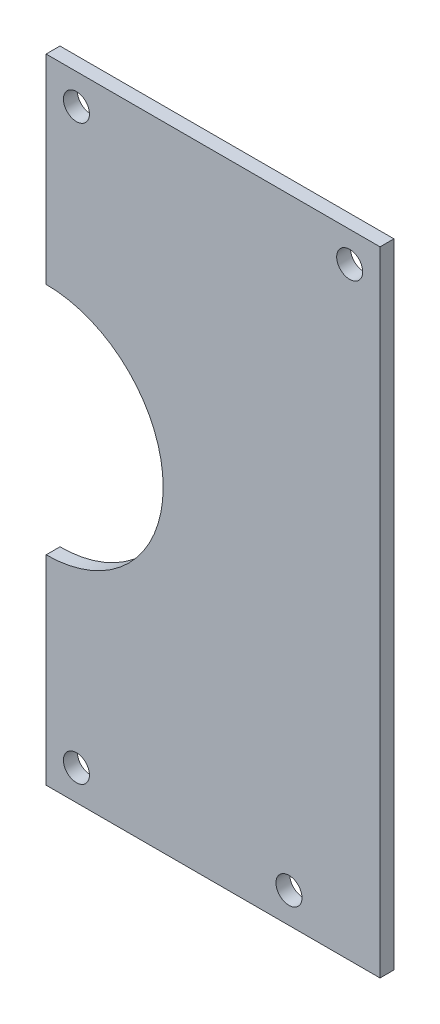
ISO-10303-21;
HEADER;
FILE_DESCRIPTION(('STEP AP214'),'2;1');
FILE_NAME('part.step','',(''),(''),'','','');
FILE_SCHEMA(('AUTOMOTIVE_DESIGN { 1 0 10303 214 1 1 1 1 }'));
ENDSEC;
DATA;
#1=APPLICATION_CONTEXT('core data for automotive mechanical design processes');
#2=APPLICATION_PROTOCOL_DEFINITION('international standard','automotive_design',2000,#1);
#3=PRODUCT_CONTEXT('',#1,'mechanical');
#4=PRODUCT('Part','Part','',(#3));
#5=PRODUCT_RELATED_PRODUCT_CATEGORY('part','',(#4));
#6=PRODUCT_DEFINITION_FORMATION('','',#4);
#7=PRODUCT_DEFINITION_CONTEXT('part definition',#1,'design');
#8=PRODUCT_DEFINITION('design','',#6,#7);
#9=PRODUCT_DEFINITION_SHAPE('','',#8);
#10=(LENGTH_UNIT() NAMED_UNIT(*) SI_UNIT(.MILLI.,.METRE.));
#11=(NAMED_UNIT(*) PLANE_ANGLE_UNIT() SI_UNIT($,.RADIAN.));
#12=(NAMED_UNIT(*) SI_UNIT($,.STERADIAN.) SOLID_ANGLE_UNIT());
#13=UNCERTAINTY_MEASURE_WITH_UNIT(LENGTH_MEASURE(1.E-05),#10,'distance_accuracy_value','');
#14=(GEOMETRIC_REPRESENTATION_CONTEXT(3) GLOBAL_UNCERTAINTY_ASSIGNED_CONTEXT((#13)) GLOBAL_UNIT_ASSIGNED_CONTEXT((#10,
#11,#12)) REPRESENTATION_CONTEXT('',''));
#15=CARTESIAN_POINT('',(0.,0.,0.));
#16=DIRECTION('',(0.,0.,1.));
#17=DIRECTION('',(1.,0.,0.));
#18=AXIS2_PLACEMENT_3D('',#15,#16,#17);
#19=CARTESIAN_POINT('',(0.,-36.5,-1.6));
#20=DIRECTION('',(-1.,0.,0.));
#21=DIRECTION('',(0.,0.,1.));
#22=AXIS2_PLACEMENT_3D('',#19,#20,#21);
#23=PLANE('',#22);
#24=DIRECTION('',(0.,-1.,0.));
#25=VECTOR('',#24,1.);
#26=CARTESIAN_POINT('',(0.,-36.5,0.));
#27=LINE('',#26,#25);
#28=CARTESIAN_POINT('',(0.,-13.5,0.));
#29=VERTEX_POINT('',#28);
#30=CARTESIAN_POINT('',(0.,-36.5,0.));
#31=VERTEX_POINT('',#30);
#32=EDGE_CURVE('E131',#29,#31,#27,.T.);
#33=ORIENTED_EDGE('',*,*,#32,.F.);
#34=DIRECTION('',(0.,0.,1.));
#35=VECTOR('',#34,1.);
#36=CARTESIAN_POINT('',(0.,-13.5,-1.6));
#37=LINE('',#36,#35);
#38=CARTESIAN_POINT('',(0.,-13.5,-1.6));
#39=VERTEX_POINT('',#38);
#40=EDGE_CURVE('E47',#39,#29,#37,.T.);
#41=ORIENTED_EDGE('',*,*,#40,.F.);
#42=DIRECTION('',(0.,-1.,0.));
#43=VECTOR('',#42,1.);
#44=CARTESIAN_POINT('',(0.,-36.5,-1.6));
#45=LINE('',#44,#43);
#46=CARTESIAN_POINT('',(0.,-36.5,-1.6));
#47=VERTEX_POINT('',#46);
#48=EDGE_CURVE('E109',#39,#47,#45,.T.);
#49=ORIENTED_EDGE('',*,*,#48,.T.);
#50=DIRECTION('',(0.,0.,1.));
#51=VECTOR('',#50,1.);
#52=CARTESIAN_POINT('',(0.,-36.5,-1.6));
#53=LINE('',#52,#51);
#54=EDGE_CURVE('E11',#47,#31,#53,.T.);
#55=ORIENTED_EDGE('',*,*,#54,.T.);
#56=EDGE_LOOP('',(#33,#41,#49,#55));
#57=FACE_BOUND('',#56,.T.);
#58=ADVANCED_FACE('F37',(#57),#23,.T.);
#59=CARTESIAN_POINT('',(0.,0.,-1.6));
#60=DIRECTION('',(0.,0.,1.));
#61=DIRECTION('',(1.,0.,0.));
#62=AXIS2_PLACEMENT_3D('',#59,#60,#61);
#63=CYLINDRICAL_SURFACE('',#62,13.5);
#64=CARTESIAN_POINT('',(0.,0.,0.));
#65=DIRECTION('',(0.,0.,-1.));
#66=DIRECTION('',(-1.,0.,0.));
#67=AXIS2_PLACEMENT_3D('',#64,#65,#66);
#68=CIRCLE('',#67,13.5);
#69=CARTESIAN_POINT('',(0.,13.5,0.));
#70=VERTEX_POINT('',#69);
#71=EDGE_CURVE('E96',#70,#29,#68,.T.);
#72=ORIENTED_EDGE('',*,*,#71,.F.);
#73=DIRECTION('',(0.,0.,1.));
#74=VECTOR('',#73,1.);
#75=CARTESIAN_POINT('',(0.,13.5,-1.6));
#76=LINE('',#75,#74);
#77=CARTESIAN_POINT('',(0.,13.5,-1.6));
#78=VERTEX_POINT('',#77);
#79=EDGE_CURVE('E91',#78,#70,#76,.T.);
#80=ORIENTED_EDGE('',*,*,#79,.F.);
#81=CARTESIAN_POINT('',(0.,0.,-1.6));
#82=DIRECTION('',(0.,0.,-1.));
#83=DIRECTION('',(-1.,0.,0.));
#84=AXIS2_PLACEMENT_3D('',#81,#82,#83);
#85=CIRCLE('',#84,13.5);
#86=EDGE_CURVE('E94',#78,#39,#85,.T.);
#87=ORIENTED_EDGE('',*,*,#86,.T.);
#88=ORIENTED_EDGE('',*,*,#40,.T.);
#89=EDGE_LOOP('',(#72,#80,#87,#88));
#90=FACE_BOUND('',#89,.T.);
#91=ADVANCED_FACE('F93',(#90),#63,.F.);
#92=CARTESIAN_POINT('',(0.,36.5,-1.6));
#93=DIRECTION('',(-1.,0.,0.));
#94=DIRECTION('',(0.,0.,1.));
#95=AXIS2_PLACEMENT_3D('',#92,#93,#94);
#96=PLANE('',#95);
#97=DIRECTION('',(0.,-1.,0.));
#98=VECTOR('',#97,1.);
#99=CARTESIAN_POINT('',(0.,36.5,0.));
#100=LINE('',#99,#98);
#101=CARTESIAN_POINT('',(0.,36.5,0.));
#102=VERTEX_POINT('',#101);
#103=EDGE_CURVE('E128',#102,#70,#100,.T.);
#104=ORIENTED_EDGE('',*,*,#103,.F.);
#105=DIRECTION('',(0.,0.,1.));
#106=VECTOR('',#105,1.);
#107=CARTESIAN_POINT('',(0.,36.5,-1.6));
#108=LINE('',#107,#106);
#109=CARTESIAN_POINT('',(0.,36.5,-1.6));
#110=VERTEX_POINT('',#109);
#111=EDGE_CURVE('E101',#110,#102,#108,.T.);
#112=ORIENTED_EDGE('',*,*,#111,.F.);
#113=DIRECTION('',(0.,-1.,0.));
#114=VECTOR('',#113,1.);
#115=CARTESIAN_POINT('',(0.,36.5,-1.6));
#116=LINE('',#115,#114);
#117=EDGE_CURVE('E107',#110,#78,#116,.T.);
#118=ORIENTED_EDGE('',*,*,#117,.T.);
#119=ORIENTED_EDGE('',*,*,#79,.T.);
#120=EDGE_LOOP('',(#104,#112,#118,#119));
#121=FACE_BOUND('',#120,.T.);
#122=ADVANCED_FACE('F112',(#121),#96,.T.);
#123=CARTESIAN_POINT('',(13.5,36.5,-1.6));
#124=DIRECTION('',(0.,1.,0.));
#125=DIRECTION('',(0.,0.,1.));
#126=AXIS2_PLACEMENT_3D('',#123,#124,#125);
#127=PLANE('',#126);
#128=DIRECTION('',(-1.,0.,0.));
#129=VECTOR('',#128,1.);
#130=CARTESIAN_POINT('',(13.5,36.5,0.));
#131=LINE('',#130,#129);
#132=CARTESIAN_POINT('',(38.5,36.5,0.));
#133=VERTEX_POINT('',#132);
#134=EDGE_CURVE('E125',#133,#102,#131,.T.);
#135=ORIENTED_EDGE('',*,*,#134,.F.);
#136=DIRECTION('',(0.,0.,1.));
#137=VECTOR('',#136,1.);
#138=CARTESIAN_POINT('',(38.5,36.5,-1.6));
#139=LINE('',#138,#137);
#140=CARTESIAN_POINT('',(38.5,36.5,-1.6));
#141=VERTEX_POINT('',#140);
#142=EDGE_CURVE('E135',#141,#133,#139,.T.);
#143=ORIENTED_EDGE('',*,*,#142,.F.);
#144=DIRECTION('',(-1.,0.,0.));
#145=VECTOR('',#144,1.);
#146=CARTESIAN_POINT('',(13.5,36.5,-1.6));
#147=LINE('',#146,#145);
#148=EDGE_CURVE('E113',#141,#110,#147,.T.);
#149=ORIENTED_EDGE('',*,*,#148,.T.);
#150=ORIENTED_EDGE('',*,*,#111,.T.);
#151=EDGE_LOOP('',(#135,#143,#149,#150));
#152=FACE_BOUND('',#151,.T.);
#153=ADVANCED_FACE('F157',(#152),#127,.T.);
#154=CARTESIAN_POINT('',(38.5,-36.5,-1.6));
#155=DIRECTION('',(1.,0.,0.));
#156=DIRECTION('',(0.,0.,-1.));
#157=AXIS2_PLACEMENT_3D('',#154,#155,#156);
#158=PLANE('',#157);
#159=DIRECTION('',(0.,1.,0.));
#160=VECTOR('',#159,1.);
#161=CARTESIAN_POINT('',(38.5,-36.5,0.));
#162=LINE('',#161,#160);
#163=CARTESIAN_POINT('',(38.5,-36.5,0.));
#164=VERTEX_POINT('',#163);
#165=EDGE_CURVE('E121',#164,#133,#162,.T.);
#166=ORIENTED_EDGE('',*,*,#165,.F.);
#167=DIRECTION('',(0.,0.,1.));
#168=VECTOR('',#167,1.);
#169=CARTESIAN_POINT('',(38.5,-36.5,-1.6));
#170=LINE('',#169,#168);
#171=CARTESIAN_POINT('',(38.5,-36.5,-1.6));
#172=VERTEX_POINT('',#171);
#173=EDGE_CURVE('E41',#172,#164,#170,.T.);
#174=ORIENTED_EDGE('',*,*,#173,.F.);
#175=DIRECTION('',(0.,1.,0.));
#176=VECTOR('',#175,1.);
#177=CARTESIAN_POINT('',(38.5,-36.5,-1.6));
#178=LINE('',#177,#176);
#179=EDGE_CURVE('E115',#172,#141,#178,.T.);
#180=ORIENTED_EDGE('',*,*,#179,.T.);
#181=ORIENTED_EDGE('',*,*,#142,.T.);
#182=EDGE_LOOP('',(#166,#174,#180,#181));
#183=FACE_BOUND('',#182,.T.);
#184=ADVANCED_FACE('F141',(#183),#158,.T.);
#185=CARTESIAN_POINT('',(13.5,-36.5,-1.6));
#186=DIRECTION('',(0.,-1.,0.));
#187=DIRECTION('',(0.,0.,-1.));
#188=AXIS2_PLACEMENT_3D('',#185,#186,#187);
#189=PLANE('',#188);
#190=DIRECTION('',(1.,0.,0.));
#191=VECTOR('',#190,1.);
#192=CARTESIAN_POINT('',(13.5,-36.5,0.));
#193=LINE('',#192,#191);
#194=EDGE_CURVE('E80',#31,#164,#193,.T.);
#195=ORIENTED_EDGE('',*,*,#194,.F.);
#196=ORIENTED_EDGE('',*,*,#54,.F.);
#197=DIRECTION('',(1.,0.,0.));
#198=VECTOR('',#197,1.);
#199=CARTESIAN_POINT('',(13.5,-36.5,-1.6));
#200=LINE('',#199,#198);
#201=EDGE_CURVE('E83',#47,#172,#200,.T.);
#202=ORIENTED_EDGE('',*,*,#201,.T.);
#203=ORIENTED_EDGE('',*,*,#173,.T.);
#204=EDGE_LOOP('',(#195,#196,#202,#203));
#205=FACE_BOUND('',#204,.T.);
#206=ADVANCED_FACE('F39',(#205),#189,.T.);
#207=CARTESIAN_POINT('',(0.,0.,-1.6));
#208=DIRECTION('',(0.,0.,-1.));
#209=DIRECTION('',(-1.,0.,0.));
#210=AXIS2_PLACEMENT_3D('',#207,#208,#209);
#211=PLANE('',#210);
#212=CARTESIAN_POINT('',(35.,33.,-1.6));
#213=DIRECTION('',(0.,0.,1.));
#214=DIRECTION('',(-1.,0.,0.));
#215=AXIS2_PLACEMENT_3D('',#212,#213,#214);
#216=CIRCLE('',#215,1.5);
#217=CARTESIAN_POINT('',(33.5,33.,-1.6));
#218=VERTEX_POINT('',#217);
#219=EDGE_CURVE('E204',#218,#218,#216,.T.);
#220=ORIENTED_EDGE('',*,*,#219,.T.);
#221=EDGE_LOOP('',(#220));
#222=FACE_BOUND('',#221,.T.);
#223=CARTESIAN_POINT('',(3.5,-33.,-1.6));
#224=DIRECTION('',(0.,0.,1.));
#225=DIRECTION('',(1.,0.,0.));
#226=AXIS2_PLACEMENT_3D('',#223,#224,#225);
#227=CIRCLE('',#226,1.5);
#228=CARTESIAN_POINT('',(5.,-33.,-1.6));
#229=VERTEX_POINT('',#228);
#230=EDGE_CURVE('E210',#229,#229,#227,.T.);
#231=ORIENTED_EDGE('',*,*,#230,.T.);
#232=EDGE_LOOP('',(#231));
#233=FACE_BOUND('',#232,.T.);
#234=CARTESIAN_POINT('',(3.5,33.,-1.6));
#235=DIRECTION('',(0.,0.,1.));
#236=DIRECTION('',(-1.,0.,0.));
#237=AXIS2_PLACEMENT_3D('',#234,#235,#236);
#238=CIRCLE('',#237,1.5);
#239=CARTESIAN_POINT('',(2.,33.,-1.6));
#240=VERTEX_POINT('',#239);
#241=EDGE_CURVE('E195',#240,#240,#238,.T.);
#242=ORIENTED_EDGE('',*,*,#241,.T.);
#243=EDGE_LOOP('',(#242));
#244=FACE_BOUND('',#243,.T.);
#245=CARTESIAN_POINT('',(28.,-33.,-1.6));
#246=DIRECTION('',(0.,0.,1.));
#247=DIRECTION('',(1.,0.,0.));
#248=AXIS2_PLACEMENT_3D('',#245,#246,#247);
#249=CIRCLE('',#248,1.5);
#250=CARTESIAN_POINT('',(29.5,-33.,-1.6));
#251=VERTEX_POINT('',#250);
#252=EDGE_CURVE('E122',#251,#251,#249,.T.);
#253=ORIENTED_EDGE('',*,*,#252,.T.);
#254=EDGE_LOOP('',(#253));
#255=FACE_BOUND('',#254,.T.);
#256=ORIENTED_EDGE('',*,*,#201,.F.);
#257=ORIENTED_EDGE('',*,*,#48,.F.);
#258=ORIENTED_EDGE('',*,*,#86,.F.);
#259=ORIENTED_EDGE('',*,*,#117,.F.);
#260=ORIENTED_EDGE('',*,*,#148,.F.);
#261=ORIENTED_EDGE('',*,*,#179,.F.);
#262=EDGE_LOOP('',(#256,#257,#258,#259,#260,#261));
#263=FACE_BOUND('',#262,.T.);
#264=ADVANCED_FACE('F105',(#222,#233,#244,#255,#263),#211,.T.);
#265=CARTESIAN_POINT('',(0.,0.,0.));
#266=DIRECTION('',(0.,0.,-1.));
#267=DIRECTION('',(-1.,0.,0.));
#268=AXIS2_PLACEMENT_3D('',#265,#266,#267);
#269=PLANE('',#268);
#270=CARTESIAN_POINT('',(35.,33.,0.));
#271=DIRECTION('',(0.,0.,1.));
#272=DIRECTION('',(-1.,0.,0.));
#273=AXIS2_PLACEMENT_3D('',#270,#271,#272);
#274=CIRCLE('',#273,1.5);
#275=CARTESIAN_POINT('',(33.5,33.,0.));
#276=VERTEX_POINT('',#275);
#277=EDGE_CURVE('E207',#276,#276,#274,.T.);
#278=ORIENTED_EDGE('',*,*,#277,.F.);
#279=EDGE_LOOP('',(#278));
#280=FACE_BOUND('',#279,.T.);
#281=CARTESIAN_POINT('',(3.5,-33.,0.));
#282=DIRECTION('',(0.,0.,1.));
#283=DIRECTION('',(1.,0.,0.));
#284=AXIS2_PLACEMENT_3D('',#281,#282,#283);
#285=CIRCLE('',#284,1.5);
#286=CARTESIAN_POINT('',(5.,-33.,0.));
#287=VERTEX_POINT('',#286);
#288=EDGE_CURVE('E201',#287,#287,#285,.T.);
#289=ORIENTED_EDGE('',*,*,#288,.F.);
#290=EDGE_LOOP('',(#289));
#291=FACE_BOUND('',#290,.T.);
#292=CARTESIAN_POINT('',(3.5,33.,0.));
#293=DIRECTION('',(0.,0.,1.));
#294=DIRECTION('',(-1.,0.,0.));
#295=AXIS2_PLACEMENT_3D('',#292,#293,#294);
#296=CIRCLE('',#295,1.5);
#297=CARTESIAN_POINT('',(2.,33.,0.));
#298=VERTEX_POINT('',#297);
#299=EDGE_CURVE('E198',#298,#298,#296,.T.);
#300=ORIENTED_EDGE('',*,*,#299,.F.);
#301=EDGE_LOOP('',(#300));
#302=FACE_BOUND('',#301,.T.);
#303=CARTESIAN_POINT('',(28.,-33.,0.));
#304=DIRECTION('',(0.,0.,1.));
#305=DIRECTION('',(1.,0.,0.));
#306=AXIS2_PLACEMENT_3D('',#303,#304,#305);
#307=CIRCLE('',#306,1.5);
#308=CARTESIAN_POINT('',(29.5,-33.,0.));
#309=VERTEX_POINT('',#308);
#310=EDGE_CURVE('E206',#309,#309,#307,.T.);
#311=ORIENTED_EDGE('',*,*,#310,.F.);
#312=EDGE_LOOP('',(#311));
#313=FACE_BOUND('',#312,.T.);
#314=ORIENTED_EDGE('',*,*,#32,.T.);
#315=ORIENTED_EDGE('',*,*,#194,.T.);
#316=ORIENTED_EDGE('',*,*,#165,.T.);
#317=ORIENTED_EDGE('',*,*,#134,.T.);
#318=ORIENTED_EDGE('',*,*,#103,.T.);
#319=ORIENTED_EDGE('',*,*,#71,.T.);
#320=EDGE_LOOP('',(#314,#315,#316,#317,#318,#319));
#321=FACE_BOUND('',#320,.T.);
#322=ADVANCED_FACE('F143',(#280,#291,#302,#313,#321),#269,.F.);
#323=CARTESIAN_POINT('',(28.,-33.,-1.6));
#324=DIRECTION('',(0.,0.,1.));
#325=DIRECTION('',(1.,0.,0.));
#326=AXIS2_PLACEMENT_3D('',#323,#324,#325);
#327=CYLINDRICAL_SURFACE('',#326,1.5);
#328=ORIENTED_EDGE('',*,*,#252,.F.);
#329=EDGE_LOOP('',(#328));
#330=FACE_BOUND('',#329,.T.);
#331=ORIENTED_EDGE('',*,*,#310,.T.);
#332=EDGE_LOOP('',(#331));
#333=FACE_BOUND('',#332,.T.);
#334=ADVANCED_FACE('F171',(#330,#333),#327,.F.);
#335=CARTESIAN_POINT('',(3.5,33.,-1.6));
#336=DIRECTION('',(0.,0.,1.));
#337=DIRECTION('',(1.,0.,0.));
#338=AXIS2_PLACEMENT_3D('',#335,#336,#337);
#339=CYLINDRICAL_SURFACE('',#338,1.5);
#340=ORIENTED_EDGE('',*,*,#241,.F.);
#341=EDGE_LOOP('',(#340));
#342=FACE_BOUND('',#341,.T.);
#343=ORIENTED_EDGE('',*,*,#299,.T.);
#344=EDGE_LOOP('',(#343));
#345=FACE_BOUND('',#344,.T.);
#346=ADVANCED_FACE('F178',(#342,#345),#339,.F.);
#347=CARTESIAN_POINT('',(3.5,-33.,-1.6));
#348=DIRECTION('',(0.,0.,1.));
#349=DIRECTION('',(1.,0.,0.));
#350=AXIS2_PLACEMENT_3D('',#347,#348,#349);
#351=CYLINDRICAL_SURFACE('',#350,1.5);
#352=ORIENTED_EDGE('',*,*,#230,.F.);
#353=EDGE_LOOP('',(#352));
#354=FACE_BOUND('',#353,.T.);
#355=ORIENTED_EDGE('',*,*,#288,.T.);
#356=EDGE_LOOP('',(#355));
#357=FACE_BOUND('',#356,.T.);
#358=ADVANCED_FACE('F180',(#354,#357),#351,.F.);
#359=CARTESIAN_POINT('',(35.,33.,-1.6));
#360=DIRECTION('',(0.,0.,1.));
#361=DIRECTION('',(1.,0.,0.));
#362=AXIS2_PLACEMENT_3D('',#359,#360,#361);
#363=CYLINDRICAL_SURFACE('',#362,1.5);
#364=ORIENTED_EDGE('',*,*,#219,.F.);
#365=EDGE_LOOP('',(#364));
#366=FACE_BOUND('',#365,.T.);
#367=ORIENTED_EDGE('',*,*,#277,.T.);
#368=EDGE_LOOP('',(#367));
#369=FACE_BOUND('',#368,.T.);
#370=ADVANCED_FACE('F183',(#366,#369),#363,.F.);
#371=CLOSED_SHELL('',(#58,#91,#122,#153,#184,#206,#264,#322,#334,#346,#358,#370));
#372=MANIFOLD_SOLID_BREP('B2',#371);
#373=ADVANCED_BREP_SHAPE_REPRESENTATION('',(#18,#372),#14);
#374=SHAPE_DEFINITION_REPRESENTATION(#9,#373);
ENDSEC;
END-ISO-10303-21;
